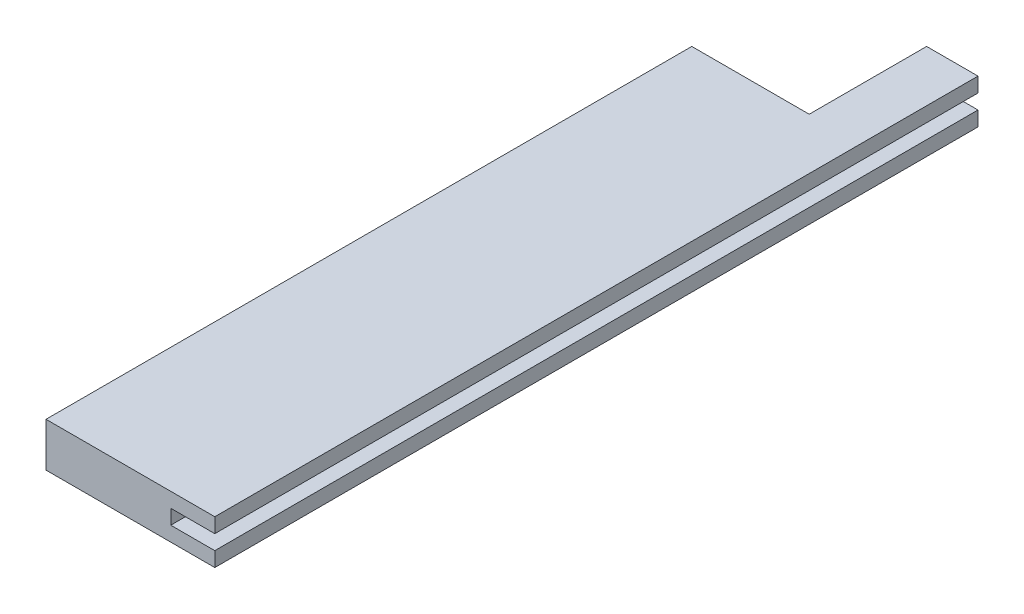
ISO-10303-21;
HEADER;
FILE_DESCRIPTION(('STEP AP214'),'2;1');
FILE_NAME('part.step','',(''),(''),'','','');
FILE_SCHEMA(('AUTOMOTIVE_DESIGN { 1 0 10303 214 1 1 1 1 }'));
ENDSEC;
DATA;
#1=APPLICATION_CONTEXT('core data for automotive mechanical design processes');
#2=APPLICATION_PROTOCOL_DEFINITION('international standard','automotive_design',2000,#1);
#3=PRODUCT_CONTEXT('',#1,'mechanical');
#4=PRODUCT('Part','Part','',(#3));
#5=PRODUCT_RELATED_PRODUCT_CATEGORY('part','',(#4));
#6=PRODUCT_DEFINITION_FORMATION('','',#4);
#7=PRODUCT_DEFINITION_CONTEXT('part definition',#1,'design');
#8=PRODUCT_DEFINITION('design','',#6,#7);
#9=PRODUCT_DEFINITION_SHAPE('','',#8);
#10=(LENGTH_UNIT() NAMED_UNIT(*) SI_UNIT(.MILLI.,.METRE.));
#11=(NAMED_UNIT(*) PLANE_ANGLE_UNIT() SI_UNIT($,.RADIAN.));
#12=(NAMED_UNIT(*) SI_UNIT($,.STERADIAN.) SOLID_ANGLE_UNIT());
#13=UNCERTAINTY_MEASURE_WITH_UNIT(LENGTH_MEASURE(1.E-05),#10,'distance_accuracy_value','');
#14=(GEOMETRIC_REPRESENTATION_CONTEXT(3) GLOBAL_UNCERTAINTY_ASSIGNED_CONTEXT((#13)) GLOBAL_UNIT_ASSIGNED_CONTEXT((#10,
#11,#12)) REPRESENTATION_CONTEXT('',''));
#15=CARTESIAN_POINT('',(0.,0.,0.));
#16=DIRECTION('',(0.,0.,1.));
#17=DIRECTION('',(1.,0.,0.));
#18=AXIS2_PLACEMENT_3D('',#15,#16,#17);
#19=CARTESIAN_POINT('',(16.2623382624768,9.525,101.318299445471));
#20=DIRECTION('',(-1.,0.,0.));
#21=DIRECTION('',(0.,0.,1.));
#22=AXIS2_PLACEMENT_3D('',#19,#20,#21);
#23=PLANE('',#22);
#24=DIRECTION('',(0.,-1.,0.));
#25=VECTOR('',#24,1.);
#26=CARTESIAN_POINT('',(16.2623382624768,9.525,-228.881700554529));
#27=LINE('',#26,#25);
#28=CARTESIAN_POINT('',(16.2623382624768,-3.175,-228.881700554529));
#29=VERTEX_POINT('',#28);
#30=CARTESIAN_POINT('',(16.2623382624768,-9.525,-228.881700554529));
#31=VERTEX_POINT('',#30);
#32=EDGE_CURVE('E169',#29,#31,#27,.T.);
#33=ORIENTED_EDGE('',*,*,#32,.F.);
#34=DIRECTION('',(0.,0.,1.));
#35=VECTOR('',#34,1.);
#36=CARTESIAN_POINT('',(16.2623382624768,-3.175,-228.882700554529));
#37=LINE('',#36,#35);
#38=CARTESIAN_POINT('',(16.2623382624768,-3.175,101.318299445471));
#39=VERTEX_POINT('',#38);
#40=EDGE_CURVE('E217',#29,#39,#37,.T.);
#41=ORIENTED_EDGE('',*,*,#40,.T.);
#42=DIRECTION('',(0.,-1.,0.));
#43=VECTOR('',#42,1.);
#44=CARTESIAN_POINT('',(16.2623382624768,9.525,101.318299445471));
#45=LINE('',#44,#43);
#46=CARTESIAN_POINT('',(16.2623382624768,-9.525,101.318299445471));
#47=VERTEX_POINT('',#46);
#48=EDGE_CURVE('E133',#39,#47,#45,.T.);
#49=ORIENTED_EDGE('',*,*,#48,.T.);
#50=DIRECTION('',(0.,0.,-1.));
#51=VECTOR('',#50,1.);
#52=CARTESIAN_POINT('',(16.2623382624768,-9.525,101.318299445471));
#53=LINE('',#52,#51);
#54=EDGE_CURVE('E160',#47,#31,#53,.T.);
#55=ORIENTED_EDGE('',*,*,#54,.T.);
#56=EDGE_LOOP('',(#33,#41,#49,#55));
#57=FACE_BOUND('',#56,.T.);
#58=ADVANCED_FACE('F39',(#57),#23,.F.);
#59=CARTESIAN_POINT('',(-5.96266173752319,9.525,-228.881700554529));
#60=DIRECTION('',(1.,0.,0.));
#61=DIRECTION('',(0.,0.,-1.));
#62=AXIS2_PLACEMENT_3D('',#59,#60,#61);
#63=PLANE('',#62);
#64=DIRECTION('',(0.,0.,1.));
#65=VECTOR('',#64,1.);
#66=CARTESIAN_POINT('',(-5.96266173752319,-9.525,-228.881700554529));
#67=LINE('',#66,#65);
#68=CARTESIAN_POINT('',(-5.96266173752319,-9.525,-228.881700554529));
#69=VERTEX_POINT('',#68);
#70=CARTESIAN_POINT('',(-5.96266173752318,-9.525,-178.081700554529));
#71=VERTEX_POINT('',#70);
#72=EDGE_CURVE('E145',#69,#71,#67,.T.);
#73=ORIENTED_EDGE('',*,*,#72,.T.);
#74=DIRECTION('',(0.,-1.,0.));
#75=VECTOR('',#74,1.);
#76=CARTESIAN_POINT('',(-5.96266173752318,9.525,-178.081700554529));
#77=LINE('',#76,#75);
#78=CARTESIAN_POINT('',(-5.96266173752318,9.525,-178.081700554529));
#79=VERTEX_POINT('',#78);
#80=EDGE_CURVE('E11',#79,#71,#77,.T.);
#81=ORIENTED_EDGE('',*,*,#80,.F.);
#82=DIRECTION('',(0.,0.,1.));
#83=VECTOR('',#82,1.);
#84=CARTESIAN_POINT('',(-5.96266173752319,9.525,-228.881700554529));
#85=LINE('',#84,#83);
#86=CARTESIAN_POINT('',(-5.96266173752319,9.525,-228.881700554529));
#87=VERTEX_POINT('',#86);
#88=EDGE_CURVE('E166',#87,#79,#85,.T.);
#89=ORIENTED_EDGE('',*,*,#88,.F.);
#90=DIRECTION('',(0.,-1.,0.));
#91=VECTOR('',#90,1.);
#92=CARTESIAN_POINT('',(-5.96266173752319,9.525,-228.881700554529));
#93=LINE('',#92,#91);
#94=EDGE_CURVE('E141',#87,#69,#93,.T.);
#95=ORIENTED_EDGE('',*,*,#94,.T.);
#96=EDGE_LOOP('',(#73,#81,#89,#95));
#97=FACE_BOUND('',#96,.T.);
#98=ADVANCED_FACE('F41',(#97),#63,.F.);
#99=CARTESIAN_POINT('',(-5.96266173752318,9.525,-178.081700554529));
#100=DIRECTION('',(0.,0.,1.));
#101=DIRECTION('',(1.,0.,0.));
#102=AXIS2_PLACEMENT_3D('',#99,#100,#101);
#103=PLANE('',#102);
#104=DIRECTION('',(-1.,0.,0.));
#105=VECTOR('',#104,1.);
#106=CARTESIAN_POINT('',(-5.96266173752318,-9.525,-178.081700554529));
#107=LINE('',#106,#105);
#108=CARTESIAN_POINT('',(-56.7626617375232,-9.525,-178.081700554529));
#109=VERTEX_POINT('',#108);
#110=EDGE_CURVE('E149',#71,#109,#107,.T.);
#111=ORIENTED_EDGE('',*,*,#110,.T.);
#112=DIRECTION('',(0.,-1.,0.));
#113=VECTOR('',#112,1.);
#114=CARTESIAN_POINT('',(-56.7626617375232,9.525,-178.081700554529));
#115=LINE('',#114,#113);
#116=CARTESIAN_POINT('',(-56.7626617375232,9.525,-178.081700554529));
#117=VERTEX_POINT('',#116);
#118=EDGE_CURVE('E48',#117,#109,#115,.T.);
#119=ORIENTED_EDGE('',*,*,#118,.F.);
#120=DIRECTION('',(-1.,0.,0.));
#121=VECTOR('',#120,1.);
#122=CARTESIAN_POINT('',(-5.96266173752318,9.525,-178.081700554529));
#123=LINE('',#122,#121);
#124=EDGE_CURVE('E98',#79,#117,#123,.T.);
#125=ORIENTED_EDGE('',*,*,#124,.F.);
#126=ORIENTED_EDGE('',*,*,#80,.T.);
#127=EDGE_LOOP('',(#111,#119,#125,#126));
#128=FACE_BOUND('',#127,.T.);
#129=ADVANCED_FACE('F262',(#128),#103,.F.);
#130=CARTESIAN_POINT('',(-56.7626617375232,9.525,-178.081700554529));
#131=DIRECTION('',(1.,0.,0.));
#132=DIRECTION('',(0.,0.,-1.));
#133=AXIS2_PLACEMENT_3D('',#130,#131,#132);
#134=PLANE('',#133);
#135=DIRECTION('',(0.,0.,1.));
#136=VECTOR('',#135,1.);
#137=CARTESIAN_POINT('',(-56.7626617375232,-9.525,-178.081700554529));
#138=LINE('',#137,#136);
#139=CARTESIAN_POINT('',(-56.7626617375231,-9.525,101.318299445471));
#140=VERTEX_POINT('',#139);
#141=EDGE_CURVE('E153',#109,#140,#138,.T.);
#142=ORIENTED_EDGE('',*,*,#141,.T.);
#143=DIRECTION('',(0.,-1.,0.));
#144=VECTOR('',#143,1.);
#145=CARTESIAN_POINT('',(-56.7626617375231,9.525,101.318299445471));
#146=LINE('',#145,#144);
#147=CARTESIAN_POINT('',(-56.7626617375231,9.525,101.318299445471));
#148=VERTEX_POINT('',#147);
#149=EDGE_CURVE('E132',#148,#140,#146,.T.);
#150=ORIENTED_EDGE('',*,*,#149,.F.);
#151=DIRECTION('',(0.,0.,1.));
#152=VECTOR('',#151,1.);
#153=CARTESIAN_POINT('',(-56.7626617375232,9.525,-178.081700554529));
#154=LINE('',#153,#152);
#155=EDGE_CURVE('E114',#117,#148,#154,.T.);
#156=ORIENTED_EDGE('',*,*,#155,.F.);
#157=ORIENTED_EDGE('',*,*,#118,.T.);
#158=EDGE_LOOP('',(#142,#150,#156,#157));
#159=FACE_BOUND('',#158,.T.);
#160=ADVANCED_FACE('F177',(#159),#134,.F.);
#161=CARTESIAN_POINT('',(-56.7626617375231,9.525,101.318299445471));
#162=DIRECTION('',(0.,0.,-1.));
#163=DIRECTION('',(-1.,0.,0.));
#164=AXIS2_PLACEMENT_3D('',#161,#162,#163);
#165=PLANE('',#164);
#166=ORIENTED_EDGE('',*,*,#48,.F.);
#167=DIRECTION('',(1.,0.,0.));
#168=VECTOR('',#167,1.);
#169=CARTESIAN_POINT('',(-2.78766173752316,-3.175,101.318299445471));
#170=LINE('',#169,#168);
#171=CARTESIAN_POINT('',(-2.78766173752316,-3.175,101.318299445471));
#172=VERTEX_POINT('',#171);
#173=EDGE_CURVE('E187',#172,#39,#170,.T.);
#174=ORIENTED_EDGE('',*,*,#173,.F.);
#175=DIRECTION('',(0.,-1.,0.));
#176=VECTOR('',#175,1.);
#177=CARTESIAN_POINT('',(-2.78766173752316,-3.175,101.318299445471));
#178=LINE('',#177,#176);
#179=CARTESIAN_POINT('',(-2.78766173752316,3.175,101.318299445471));
#180=VERTEX_POINT('',#179);
#181=EDGE_CURVE('E239',#180,#172,#178,.T.);
#182=ORIENTED_EDGE('',*,*,#181,.F.);
#183=DIRECTION('',(-1.,0.,0.));
#184=VECTOR('',#183,1.);
#185=CARTESIAN_POINT('',(-2.78766173752316,3.175,101.318299445471));
#186=LINE('',#185,#184);
#187=CARTESIAN_POINT('',(16.2623382624768,3.175,101.318299445471));
#188=VERTEX_POINT('',#187);
#189=EDGE_CURVE('E128',#188,#180,#186,.T.);
#190=ORIENTED_EDGE('',*,*,#189,.F.);
#191=CARTESIAN_POINT('',(16.2623382624768,9.525,101.318299445471));
#192=VERTEX_POINT('',#191);
#193=EDGE_CURVE('E122',#192,#188,#45,.T.);
#194=ORIENTED_EDGE('',*,*,#193,.F.);
#195=DIRECTION('',(1.,0.,0.));
#196=VECTOR('',#195,1.);
#197=CARTESIAN_POINT('',(-56.7626617375231,9.525,101.318299445471));
#198=LINE('',#197,#196);
#199=EDGE_CURVE('E107',#148,#192,#198,.T.);
#200=ORIENTED_EDGE('',*,*,#199,.F.);
#201=ORIENTED_EDGE('',*,*,#149,.T.);
#202=DIRECTION('',(1.,0.,0.));
#203=VECTOR('',#202,1.);
#204=CARTESIAN_POINT('',(-56.7626617375231,-9.525,101.318299445471));
#205=LINE('',#204,#203);
#206=EDGE_CURVE('E156',#140,#47,#205,.T.);
#207=ORIENTED_EDGE('',*,*,#206,.T.);
#208=EDGE_LOOP('',(#166,#174,#182,#190,#194,#200,#201,#207));
#209=FACE_BOUND('',#208,.T.);
#210=ADVANCED_FACE('F124',(#209),#165,.F.);
#211=ORIENTED_EDGE('',*,*,#193,.T.);
#212=DIRECTION('',(0.,0.,1.));
#213=VECTOR('',#212,1.);
#214=CARTESIAN_POINT('',(16.2623382624768,3.175,-228.882700554529));
#215=LINE('',#214,#213);
#216=CARTESIAN_POINT('',(16.2623382624768,3.175,-228.881700554529));
#217=VERTEX_POINT('',#216);
#218=EDGE_CURVE('E231',#217,#188,#215,.T.);
#219=ORIENTED_EDGE('',*,*,#218,.F.);
#220=CARTESIAN_POINT('',(16.2623382624768,9.525,-228.881700554529));
#221=VERTEX_POINT('',#220);
#222=EDGE_CURVE('E137',#221,#217,#27,.T.);
#223=ORIENTED_EDGE('',*,*,#222,.F.);
#224=DIRECTION('',(0.,0.,-1.));
#225=VECTOR('',#224,1.);
#226=CARTESIAN_POINT('',(16.2623382624768,9.525,101.318299445471));
#227=LINE('',#226,#225);
#228=EDGE_CURVE('E111',#192,#221,#227,.T.);
#229=ORIENTED_EDGE('',*,*,#228,.F.);
#230=EDGE_LOOP('',(#211,#219,#223,#229));
#231=FACE_BOUND('',#230,.T.);
#232=ADVANCED_FACE('F135',(#231),#23,.F.);
#233=CARTESIAN_POINT('',(16.2623382624768,9.525,-228.881700554529));
#234=DIRECTION('',(0.,0.,1.));
#235=DIRECTION('',(1.,0.,0.));
#236=AXIS2_PLACEMENT_3D('',#233,#234,#235);
#237=PLANE('',#236);
#238=DIRECTION('',(0.,1.,0.));
#239=VECTOR('',#238,1.);
#240=CARTESIAN_POINT('',(-2.78766173752316,-3.175,-228.881700554529));
#241=LINE('',#240,#239);
#242=CARTESIAN_POINT('',(-2.78766173752316,-3.175,-228.881700554529));
#243=VERTEX_POINT('',#242);
#244=CARTESIAN_POINT('',(-2.78766173752316,3.175,-228.881700554529));
#245=VERTEX_POINT('',#244);
#246=EDGE_CURVE('E55',#243,#245,#241,.T.);
#247=ORIENTED_EDGE('',*,*,#246,.F.);
#248=DIRECTION('',(-1.,0.,0.));
#249=VECTOR('',#248,1.);
#250=CARTESIAN_POINT('',(-2.78766173752316,-3.175,-228.881700554529));
#251=LINE('',#250,#249);
#252=EDGE_CURVE('E198',#29,#243,#251,.T.);
#253=ORIENTED_EDGE('',*,*,#252,.F.);
#254=ORIENTED_EDGE('',*,*,#32,.T.);
#255=DIRECTION('',(-1.,0.,0.));
#256=VECTOR('',#255,1.);
#257=CARTESIAN_POINT('',(16.2623382624768,-9.525,-228.881700554529));
#258=LINE('',#257,#256);
#259=EDGE_CURVE('E90',#31,#69,#258,.T.);
#260=ORIENTED_EDGE('',*,*,#259,.T.);
#261=ORIENTED_EDGE('',*,*,#94,.F.);
#262=DIRECTION('',(-1.,0.,0.));
#263=VECTOR('',#262,1.);
#264=CARTESIAN_POINT('',(16.2623382624768,9.525,-228.881700554529));
#265=LINE('',#264,#263);
#266=EDGE_CURVE('E64',#221,#87,#265,.T.);
#267=ORIENTED_EDGE('',*,*,#266,.F.);
#268=ORIENTED_EDGE('',*,*,#222,.T.);
#269=DIRECTION('',(1.,0.,0.));
#270=VECTOR('',#269,1.);
#271=CARTESIAN_POINT('',(-2.78766173752316,3.175,-228.881700554529));
#272=LINE('',#271,#270);
#273=EDGE_CURVE('E150',#245,#217,#272,.T.);
#274=ORIENTED_EDGE('',*,*,#273,.F.);
#275=EDGE_LOOP('',(#247,#253,#254,#260,#261,#267,#268,#274));
#276=FACE_BOUND('',#275,.T.);
#277=ADVANCED_FACE('F196',(#276),#237,.F.);
#278=CARTESIAN_POINT('',(0.,9.525,0.));
#279=DIRECTION('',(0.,-1.,0.));
#280=DIRECTION('',(0.,0.,-1.));
#281=AXIS2_PLACEMENT_3D('',#278,#279,#280);
#282=PLANE('',#281);
#283=ORIENTED_EDGE('',*,*,#88,.T.);
#284=ORIENTED_EDGE('',*,*,#124,.T.);
#285=ORIENTED_EDGE('',*,*,#155,.T.);
#286=ORIENTED_EDGE('',*,*,#199,.T.);
#287=ORIENTED_EDGE('',*,*,#228,.T.);
#288=ORIENTED_EDGE('',*,*,#266,.T.);
#289=EDGE_LOOP('',(#283,#284,#285,#286,#287,#288));
#290=FACE_BOUND('',#289,.T.);
#291=ADVANCED_FACE('F109',(#290),#282,.F.);
#292=CARTESIAN_POINT('',(0.,-9.525,0.));
#293=DIRECTION('',(0.,-1.,0.));
#294=DIRECTION('',(0.,0.,-1.));
#295=AXIS2_PLACEMENT_3D('',#292,#293,#294);
#296=PLANE('',#295);
#297=ORIENTED_EDGE('',*,*,#72,.F.);
#298=ORIENTED_EDGE('',*,*,#259,.F.);
#299=ORIENTED_EDGE('',*,*,#54,.F.);
#300=ORIENTED_EDGE('',*,*,#206,.F.);
#301=ORIENTED_EDGE('',*,*,#141,.F.);
#302=ORIENTED_EDGE('',*,*,#110,.F.);
#303=EDGE_LOOP('',(#297,#298,#299,#300,#301,#302));
#304=FACE_BOUND('',#303,.T.);
#305=ADVANCED_FACE('F181',(#304),#296,.T.);
#306=CARTESIAN_POINT('',(-2.78766173752316,-3.175,-228.882700554529));
#307=DIRECTION('',(0.,-1.,0.));
#308=DIRECTION('',(0.,0.,-1.));
#309=AXIS2_PLACEMENT_3D('',#306,#307,#308);
#310=PLANE('',#309);
#311=ORIENTED_EDGE('',*,*,#252,.T.);
#312=DIRECTION('',(0.,0.,1.));
#313=VECTOR('',#312,1.);
#314=CARTESIAN_POINT('',(-2.78766173752316,-3.175,-228.882700554529));
#315=LINE('',#314,#313);
#316=EDGE_CURVE('E214',#243,#172,#315,.T.);
#317=ORIENTED_EDGE('',*,*,#316,.T.);
#318=ORIENTED_EDGE('',*,*,#173,.T.);
#319=ORIENTED_EDGE('',*,*,#40,.F.);
#320=EDGE_LOOP('',(#311,#317,#318,#319));
#321=FACE_BOUND('',#320,.T.);
#322=ADVANCED_FACE('F218',(#321),#310,.F.);
#323=CARTESIAN_POINT('',(-2.78766173752316,-3.175,-228.882700554529));
#324=DIRECTION('',(-1.,0.,0.));
#325=DIRECTION('',(0.,0.,1.));
#326=AXIS2_PLACEMENT_3D('',#323,#324,#325);
#327=PLANE('',#326);
#328=ORIENTED_EDGE('',*,*,#246,.T.);
#329=DIRECTION('',(0.,0.,1.));
#330=VECTOR('',#329,1.);
#331=CARTESIAN_POINT('',(-2.78766173752316,3.175,-228.882700554529));
#332=LINE('',#331,#330);
#333=EDGE_CURVE('E224',#245,#180,#332,.T.);
#334=ORIENTED_EDGE('',*,*,#333,.T.);
#335=ORIENTED_EDGE('',*,*,#181,.T.);
#336=ORIENTED_EDGE('',*,*,#316,.F.);
#337=EDGE_LOOP('',(#328,#334,#335,#336));
#338=FACE_BOUND('',#337,.T.);
#339=ADVANCED_FACE('F248',(#338),#327,.F.);
#340=CARTESIAN_POINT('',(-2.78766173752316,3.175,-228.882700554529));
#341=DIRECTION('',(0.,1.,0.));
#342=DIRECTION('',(0.,0.,1.));
#343=AXIS2_PLACEMENT_3D('',#340,#341,#342);
#344=PLANE('',#343);
#345=ORIENTED_EDGE('',*,*,#273,.T.);
#346=ORIENTED_EDGE('',*,*,#218,.T.);
#347=ORIENTED_EDGE('',*,*,#189,.T.);
#348=ORIENTED_EDGE('',*,*,#333,.F.);
#349=EDGE_LOOP('',(#345,#346,#347,#348));
#350=FACE_BOUND('',#349,.T.);
#351=ADVANCED_FACE('F247',(#350),#344,.F.);
#352=CLOSED_SHELL('',(#58,#98,#129,#160,#210,#232,#277,#291,#305,#322,#339,#351));
#353=MANIFOLD_SOLID_BREP('B2',#352);
#354=ADVANCED_BREP_SHAPE_REPRESENTATION('',(#18,#353),#14);
#355=SHAPE_DEFINITION_REPRESENTATION(#9,#354);
ENDSEC;
END-ISO-10303-21;
